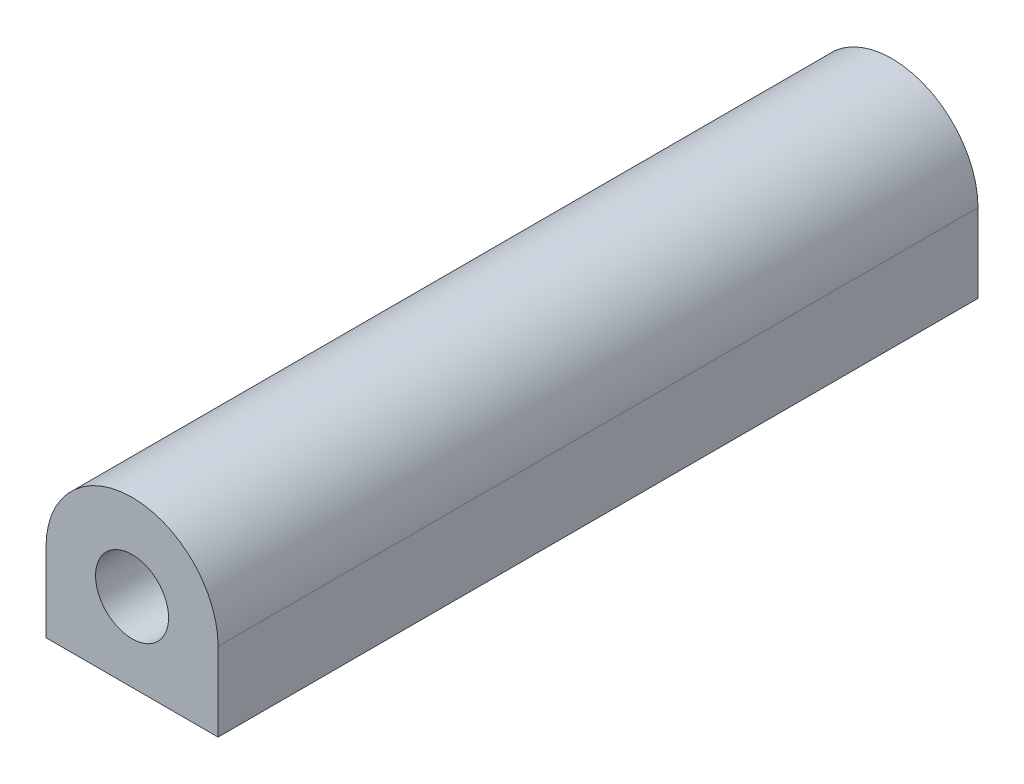
ISO-10303-21;
HEADER;
FILE_DESCRIPTION(('STEP AP214'),'2;1');
FILE_NAME('part.step','',(''),(''),'','','');
FILE_SCHEMA(('AUTOMOTIVE_DESIGN { 1 0 10303 214 1 1 1 1 }'));
ENDSEC;
DATA;
#1=APPLICATION_CONTEXT('core data for automotive mechanical design processes');
#2=APPLICATION_PROTOCOL_DEFINITION('international standard','automotive_design',2000,#1);
#3=PRODUCT_CONTEXT('',#1,'mechanical');
#4=PRODUCT('Part','Part','',(#3));
#5=PRODUCT_RELATED_PRODUCT_CATEGORY('part','',(#4));
#6=PRODUCT_DEFINITION_FORMATION('','',#4);
#7=PRODUCT_DEFINITION_CONTEXT('part definition',#1,'design');
#8=PRODUCT_DEFINITION('design','',#6,#7);
#9=PRODUCT_DEFINITION_SHAPE('','',#8);
#10=(LENGTH_UNIT() NAMED_UNIT(*) SI_UNIT(.MILLI.,.METRE.));
#11=(NAMED_UNIT(*) PLANE_ANGLE_UNIT() SI_UNIT($,.RADIAN.));
#12=(NAMED_UNIT(*) SI_UNIT($,.STERADIAN.) SOLID_ANGLE_UNIT());
#13=UNCERTAINTY_MEASURE_WITH_UNIT(LENGTH_MEASURE(1.E-05),#10,'distance_accuracy_value','');
#14=(GEOMETRIC_REPRESENTATION_CONTEXT(3) GLOBAL_UNCERTAINTY_ASSIGNED_CONTEXT((#13)) GLOBAL_UNIT_ASSIGNED_CONTEXT((#10,
#11,#12)) REPRESENTATION_CONTEXT('',''));
#15=CARTESIAN_POINT('',(0.,0.,0.));
#16=DIRECTION('',(0.,0.,1.));
#17=DIRECTION('',(1.,0.,0.));
#18=AXIS2_PLACEMENT_3D('',#15,#16,#17);
#19=CARTESIAN_POINT('',(0.,0.,30.6846));
#20=DIRECTION('',(0.,0.,1.));
#21=DIRECTION('',(1.,0.,0.));
#22=AXIS2_PLACEMENT_3D('',#19,#20,#21);
#23=PLANE('',#22);
#24=CARTESIAN_POINT('',(0.,0.,30.6846));
#25=DIRECTION('',(0.,0.,1.));
#26=DIRECTION('',(1.,0.,0.));
#27=AXIS2_PLACEMENT_3D('',#24,#25,#26);
#28=CIRCLE('',#27,1.475);
#29=CARTESIAN_POINT('',(1.475,0.,30.6846));
#30=VERTEX_POINT('',#29);
#31=EDGE_CURVE('E136',#30,#30,#28,.T.);
#32=ORIENTED_EDGE('',*,*,#31,.F.);
#33=EDGE_LOOP('',(#32));
#34=FACE_BOUND('',#33,.T.);
#35=DIRECTION('',(0.,-1.,0.));
#36=VECTOR('',#35,1.);
#37=CARTESIAN_POINT('',(-3.475,0.,30.6846));
#38=LINE('',#37,#36);
#39=CARTESIAN_POINT('',(-3.475,0.,30.6846));
#40=VERTEX_POINT('',#39);
#41=CARTESIAN_POINT('',(-3.475,-3.175,30.6846));
#42=VERTEX_POINT('',#41);
#43=EDGE_CURVE('E121',#40,#42,#38,.T.);
#44=ORIENTED_EDGE('',*,*,#43,.T.);
#45=DIRECTION('',(-1.,0.,0.));
#46=VECTOR('',#45,1.);
#47=CARTESIAN_POINT('',(-3.475,-3.175,30.6846));
#48=LINE('',#47,#46);
#49=CARTESIAN_POINT('',(3.475,-3.175,30.6846));
#50=VERTEX_POINT('',#49);
#51=EDGE_CURVE('E77',#50,#42,#48,.T.);
#52=ORIENTED_EDGE('',*,*,#51,.F.);
#53=DIRECTION('',(0.,-1.,0.));
#54=VECTOR('',#53,1.);
#55=CARTESIAN_POINT('',(3.475,0.,30.6846));
#56=LINE('',#55,#54);
#57=CARTESIAN_POINT('',(3.475,0.,30.6846));
#58=VERTEX_POINT('',#57);
#59=EDGE_CURVE('E128',#58,#50,#56,.T.);
#60=ORIENTED_EDGE('',*,*,#59,.F.);
#61=CARTESIAN_POINT('',(0.,0.,30.6846));
#62=DIRECTION('',(0.,0.,1.));
#63=DIRECTION('',(1.,0.,0.));
#64=AXIS2_PLACEMENT_3D('',#61,#62,#63);
#65=CIRCLE('',#64,3.475);
#66=EDGE_CURVE('E12',#58,#40,#65,.T.);
#67=ORIENTED_EDGE('',*,*,#66,.T.);
#68=EDGE_LOOP('',(#44,#52,#60,#67));
#69=FACE_BOUND('',#68,.T.);
#70=ADVANCED_FACE('F62',(#34,#69),#23,.T.);
#71=CARTESIAN_POINT('',(0.,0.,0.));
#72=DIRECTION('',(0.,0.,1.));
#73=DIRECTION('',(1.,0.,0.));
#74=AXIS2_PLACEMENT_3D('',#71,#72,#73);
#75=PLANE('',#74);
#76=CARTESIAN_POINT('',(0.,0.,0.));
#77=DIRECTION('',(0.,0.,-1.));
#78=DIRECTION('',(-1.,0.,0.));
#79=AXIS2_PLACEMENT_3D('',#76,#77,#78);
#80=CIRCLE('',#79,1.475);
#81=CARTESIAN_POINT('',(-1.475,0.,0.));
#82=VERTEX_POINT('',#81);
#83=EDGE_CURVE('E131',#82,#82,#80,.T.);
#84=ORIENTED_EDGE('',*,*,#83,.F.);
#85=EDGE_LOOP('',(#84));
#86=FACE_BOUND('',#85,.T.);
#87=DIRECTION('',(1.,0.,0.));
#88=VECTOR('',#87,1.);
#89=CARTESIAN_POINT('',(-3.475,-3.175,0.));
#90=LINE('',#89,#88);
#91=CARTESIAN_POINT('',(-3.475,-3.175,0.));
#92=VERTEX_POINT('',#91);
#93=CARTESIAN_POINT('',(3.475,-3.175,0.));
#94=VERTEX_POINT('',#93);
#95=EDGE_CURVE('E103',#92,#94,#90,.T.);
#96=ORIENTED_EDGE('',*,*,#95,.F.);
#97=DIRECTION('',(0.,-1.,0.));
#98=VECTOR('',#97,1.);
#99=CARTESIAN_POINT('',(-3.475,0.,0.));
#100=LINE('',#99,#98);
#101=CARTESIAN_POINT('',(-3.475,0.,0.));
#102=VERTEX_POINT('',#101);
#103=EDGE_CURVE('E113',#102,#92,#100,.T.);
#104=ORIENTED_EDGE('',*,*,#103,.F.);
#105=CARTESIAN_POINT('',(0.,0.,0.));
#106=DIRECTION('',(0.,0.,1.));
#107=DIRECTION('',(1.,0.,0.));
#108=AXIS2_PLACEMENT_3D('',#105,#106,#107);
#109=CIRCLE('',#108,3.475);
#110=CARTESIAN_POINT('',(3.475,0.,0.));
#111=VERTEX_POINT('',#110);
#112=EDGE_CURVE('E66',#111,#102,#109,.T.);
#113=ORIENTED_EDGE('',*,*,#112,.F.);
#114=DIRECTION('',(0.,-1.,0.));
#115=VECTOR('',#114,1.);
#116=CARTESIAN_POINT('',(3.475,0.,0.));
#117=LINE('',#116,#115);
#118=EDGE_CURVE('E116',#111,#94,#117,.T.);
#119=ORIENTED_EDGE('',*,*,#118,.T.);
#120=EDGE_LOOP('',(#96,#104,#113,#119));
#121=FACE_BOUND('',#120,.T.);
#122=ADVANCED_FACE('F112',(#86,#121),#75,.F.);
#123=CARTESIAN_POINT('',(3.475,0.,35.5989921292465));
#124=DIRECTION('',(1.,0.,0.));
#125=DIRECTION('',(0.,0.,-1.));
#126=AXIS2_PLACEMENT_3D('',#123,#124,#125);
#127=PLANE('',#126);
#128=ORIENTED_EDGE('',*,*,#59,.T.);
#129=DIRECTION('',(0.,0.,1.));
#130=VECTOR('',#129,1.);
#131=CARTESIAN_POINT('',(3.475,-3.175,30.6846));
#132=LINE('',#131,#130);
#133=EDGE_CURVE('E117',#94,#50,#132,.T.);
#134=ORIENTED_EDGE('',*,*,#133,.F.);
#135=ORIENTED_EDGE('',*,*,#118,.F.);
#136=DIRECTION('',(0.,0.,-1.));
#137=VECTOR('',#136,1.);
#138=CARTESIAN_POINT('',(3.475,0.,35.5989921292465));
#139=LINE('',#138,#137);
#140=EDGE_CURVE('E127',#58,#111,#139,.T.);
#141=ORIENTED_EDGE('',*,*,#140,.F.);
#142=EDGE_LOOP('',(#128,#134,#135,#141));
#143=FACE_BOUND('',#142,.T.);
#144=ADVANCED_FACE('F152',(#143),#127,.T.);
#145=CARTESIAN_POINT('',(-3.475,0.,35.5989921292465));
#146=DIRECTION('',(1.,0.,0.));
#147=DIRECTION('',(0.,0.,-1.));
#148=AXIS2_PLACEMENT_3D('',#145,#146,#147);
#149=PLANE('',#148);
#150=DIRECTION('',(0.,0.,-1.));
#151=VECTOR('',#150,1.);
#152=CARTESIAN_POINT('',(-3.475,-3.175,30.6846));
#153=LINE('',#152,#151);
#154=EDGE_CURVE('E100',#42,#92,#153,.T.);
#155=ORIENTED_EDGE('',*,*,#154,.F.);
#156=ORIENTED_EDGE('',*,*,#43,.F.);
#157=DIRECTION('',(0.,0.,-1.));
#158=VECTOR('',#157,1.);
#159=CARTESIAN_POINT('',(-3.475,0.,35.5989921292465));
#160=LINE('',#159,#158);
#161=EDGE_CURVE('E120',#40,#102,#160,.T.);
#162=ORIENTED_EDGE('',*,*,#161,.T.);
#163=ORIENTED_EDGE('',*,*,#103,.T.);
#164=EDGE_LOOP('',(#155,#156,#162,#163));
#165=FACE_BOUND('',#164,.T.);
#166=ADVANCED_FACE('F119',(#165),#149,.F.);
#167=CARTESIAN_POINT('',(0.,0.,30.6846));
#168=DIRECTION('',(0.,0.,-1.));
#169=DIRECTION('',(-1.,0.,0.));
#170=AXIS2_PLACEMENT_3D('',#167,#168,#169);
#171=CYLINDRICAL_SURFACE('',#170,3.475);
#172=ORIENTED_EDGE('',*,*,#161,.F.);
#173=ORIENTED_EDGE('',*,*,#66,.F.);
#174=ORIENTED_EDGE('',*,*,#140,.T.);
#175=ORIENTED_EDGE('',*,*,#112,.T.);
#176=EDGE_LOOP('',(#172,#173,#174,#175));
#177=FACE_BOUND('',#176,.T.);
#178=ADVANCED_FACE('F64',(#177),#171,.T.);
#179=CARTESIAN_POINT('',(0.,0.,20.6846));
#180=DIRECTION('',(0.,0.,1.));
#181=DIRECTION('',(1.,0.,0.));
#182=AXIS2_PLACEMENT_3D('',#179,#180,#181);
#183=CYLINDRICAL_SURFACE('',#182,1.475);
#184=CARTESIAN_POINT('',(0.,0.,20.6846));
#185=DIRECTION('',(0.,0.,1.));
#186=DIRECTION('',(1.,0.,0.));
#187=AXIS2_PLACEMENT_3D('',#184,#185,#186);
#188=CIRCLE('',#187,1.475);
#189=CARTESIAN_POINT('',(1.475,0.,20.6846));
#190=VERTEX_POINT('',#189);
#191=EDGE_CURVE('E139',#190,#190,#188,.T.);
#192=ORIENTED_EDGE('',*,*,#191,.F.);
#193=EDGE_LOOP('',(#192));
#194=FACE_BOUND('',#193,.T.);
#195=ORIENTED_EDGE('',*,*,#31,.T.);
#196=EDGE_LOOP('',(#195));
#197=FACE_BOUND('',#196,.T.);
#198=ADVANCED_FACE('F145',(#194,#197),#183,.F.);
#199=CARTESIAN_POINT('',(0.,0.,20.6846));
#200=DIRECTION('',(0.,0.,1.));
#201=DIRECTION('',(1.,0.,0.));
#202=AXIS2_PLACEMENT_3D('',#199,#200,#201);
#203=PLANE('',#202);
#204=ORIENTED_EDGE('',*,*,#191,.T.);
#205=EDGE_LOOP('',(#204));
#206=FACE_BOUND('',#205,.T.);
#207=ADVANCED_FACE('F172',(#206),#203,.T.);
#208=CARTESIAN_POINT('',(0.,0.,10.));
#209=DIRECTION('',(0.,0.,-1.));
#210=DIRECTION('',(-1.,0.,0.));
#211=AXIS2_PLACEMENT_3D('',#208,#209,#210);
#212=CYLINDRICAL_SURFACE('',#211,1.475);
#213=CARTESIAN_POINT('',(0.,0.,10.));
#214=DIRECTION('',(0.,0.,-1.));
#215=DIRECTION('',(-1.,0.,0.));
#216=AXIS2_PLACEMENT_3D('',#213,#214,#215);
#217=CIRCLE('',#216,1.475);
#218=CARTESIAN_POINT('',(-1.475,0.,10.));
#219=VERTEX_POINT('',#218);
#220=EDGE_CURVE('E133',#219,#219,#217,.T.);
#221=ORIENTED_EDGE('',*,*,#220,.F.);
#222=EDGE_LOOP('',(#221));
#223=FACE_BOUND('',#222,.T.);
#224=ORIENTED_EDGE('',*,*,#83,.T.);
#225=EDGE_LOOP('',(#224));
#226=FACE_BOUND('',#225,.T.);
#227=ADVANCED_FACE('F168',(#223,#226),#212,.F.);
#228=CARTESIAN_POINT('',(0.,0.,10.));
#229=DIRECTION('',(0.,0.,-1.));
#230=DIRECTION('',(-1.,0.,0.));
#231=AXIS2_PLACEMENT_3D('',#228,#229,#230);
#232=PLANE('',#231);
#233=ORIENTED_EDGE('',*,*,#220,.T.);
#234=EDGE_LOOP('',(#233));
#235=FACE_BOUND('',#234,.T.);
#236=ADVANCED_FACE('F165',(#235),#232,.T.);
#237=CARTESIAN_POINT('',(0.,-3.175,0.));
#238=DIRECTION('',(0.,-1.,0.));
#239=DIRECTION('',(0.,0.,-1.));
#240=AXIS2_PLACEMENT_3D('',#237,#238,#239);
#241=PLANE('',#240);
#242=ORIENTED_EDGE('',*,*,#154,.T.);
#243=ORIENTED_EDGE('',*,*,#95,.T.);
#244=ORIENTED_EDGE('',*,*,#133,.T.);
#245=ORIENTED_EDGE('',*,*,#51,.T.);
#246=EDGE_LOOP('',(#242,#243,#244,#245));
#247=FACE_BOUND('',#246,.T.);
#248=ADVANCED_FACE('F102',(#247),#241,.T.);
#249=CLOSED_SHELL('',(#70,#122,#144,#166,#178,#198,#207,#227,#236,#248));
#250=MANIFOLD_SOLID_BREP('B2',#249);
#251=ADVANCED_BREP_SHAPE_REPRESENTATION('',(#18,#250),#14);
#252=SHAPE_DEFINITION_REPRESENTATION(#9,#251);
ENDSEC;
END-ISO-10303-21;
